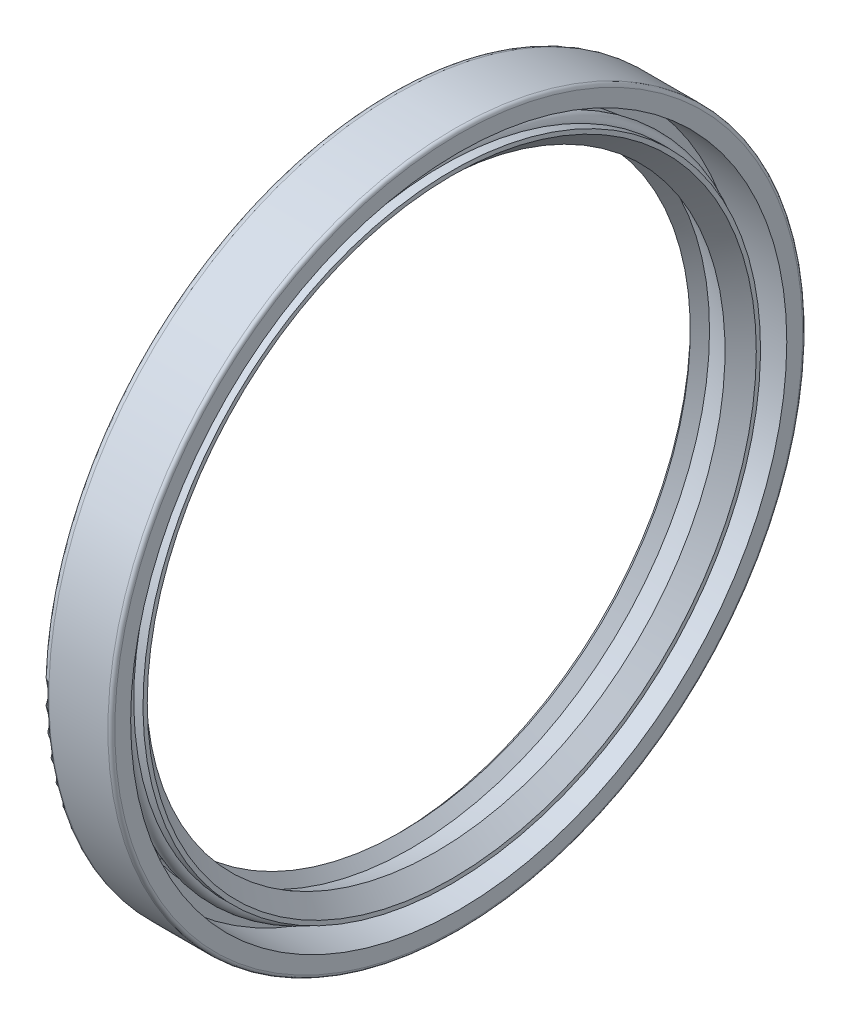
ISO-10303-21;
HEADER;
FILE_DESCRIPTION(('STEP AP214'),'2;1');
FILE_NAME('part.step','',(''),(''),'','','');
FILE_SCHEMA(('AUTOMOTIVE_DESIGN { 1 0 10303 214 1 1 1 1 }'));
ENDSEC;
DATA;
#1=APPLICATION_CONTEXT('core data for automotive mechanical design processes');
#2=APPLICATION_PROTOCOL_DEFINITION('international standard','automotive_design',2000,#1);
#3=PRODUCT_CONTEXT('',#1,'mechanical');
#4=PRODUCT('Part','Part','',(#3));
#5=PRODUCT_RELATED_PRODUCT_CATEGORY('part','',(#4));
#6=PRODUCT_DEFINITION_FORMATION('','',#4);
#7=PRODUCT_DEFINITION_CONTEXT('part definition',#1,'design');
#8=PRODUCT_DEFINITION('design','',#6,#7);
#9=PRODUCT_DEFINITION_SHAPE('','',#8);
#10=(LENGTH_UNIT() NAMED_UNIT(*) SI_UNIT(.MILLI.,.METRE.));
#11=(NAMED_UNIT(*) PLANE_ANGLE_UNIT() SI_UNIT($,.RADIAN.));
#12=(NAMED_UNIT(*) SI_UNIT($,.STERADIAN.) SOLID_ANGLE_UNIT());
#13=UNCERTAINTY_MEASURE_WITH_UNIT(LENGTH_MEASURE(1.E-05),#10,'distance_accuracy_value','');
#14=(GEOMETRIC_REPRESENTATION_CONTEXT(3) GLOBAL_UNCERTAINTY_ASSIGNED_CONTEXT((#13)) GLOBAL_UNIT_ASSIGNED_CONTEXT((#10,
#11,#12)) REPRESENTATION_CONTEXT('',''));
#15=CARTESIAN_POINT('',(0.,0.,0.));
#16=DIRECTION('',(0.,0.,1.));
#17=DIRECTION('',(1.,0.,0.));
#18=AXIS2_PLACEMENT_3D('',#15,#16,#17);
#19=CARTESIAN_POINT('',(8.,0.,0.));
#20=DIRECTION('',(-1.,0.,0.));
#21=DIRECTION('',(0.,0.,1.));
#22=AXIS2_PLACEMENT_3D('',#19,#20,#21);
#23=TOROIDAL_SURFACE('',#22,53.3333333333333,1.20000000000001);
#24=CARTESIAN_POINT('',(8.,0.,54.5333333333333));
#25=VERTEX_POINT('',#24);
#26=VERTEX_LOOP('',#25);
#27=FACE_BOUND('',#26,.T.);
#28=ADVANCED_FACE('F47',(#27),#23,.T.);
#29=CLOSED_SHELL('',(#28));
#30=MANIFOLD_SOLID_BREP('B2',#29);
#31=CARTESIAN_POINT('',(0.,58.8,0.));
#32=DIRECTION('',(1.,0.,0.));
#33=DIRECTION('',(0.,1.,0.));
#34=AXIS2_PLACEMENT_3D('',#31,#32,#33);
#35=PLANE('',#34);
#36=CARTESIAN_POINT('',(0.,0.,0.));
#37=DIRECTION('',(-1.,0.,0.));
#38=DIRECTION('',(0.,-1.,0.));
#39=AXIS2_PLACEMENT_3D('',#36,#37,#38);
#40=CIRCLE('',#39,56.6666666666667);
#41=CARTESIAN_POINT('',(0.,-56.6666666666667,0.));
#42=VERTEX_POINT('',#41);
#43=EDGE_CURVE('E46',#42,#42,#40,.T.);
#44=ORIENTED_EDGE('',*,*,#43,.F.);
#45=EDGE_LOOP('',(#44));
#46=FACE_BOUND('',#45,.T.);
#47=CARTESIAN_POINT('',(0.,0.,0.));
#48=DIRECTION('',(-1.,0.,0.));
#49=DIRECTION('',(0.,-1.,0.));
#50=AXIS2_PLACEMENT_3D('',#47,#48,#49);
#51=CIRCLE('',#50,58.8);
#52=CARTESIAN_POINT('',(0.,-58.8,0.));
#53=VERTEX_POINT('',#52);
#54=EDGE_CURVE('E153',#53,#53,#51,.T.);
#55=ORIENTED_EDGE('',*,*,#54,.T.);
#56=EDGE_LOOP('',(#55));
#57=FACE_BOUND('',#56,.T.);
#58=ADVANCED_FACE('F60',(#46,#57),#35,.F.);
#59=CARTESIAN_POINT('',(12.,0.,0.));
#60=DIRECTION('',(-1.,0.,0.));
#61=DIRECTION('',(0.,-1.,0.));
#62=AXIS2_PLACEMENT_3D('',#59,#60,#61);
#63=CYLINDRICAL_SURFACE('',#62,56.6666666666666);
#64=CARTESIAN_POINT('',(0.375,0.,0.));
#65=DIRECTION('',(-1.,0.,0.));
#66=DIRECTION('',(0.,-1.,0.));
#67=AXIS2_PLACEMENT_3D('',#64,#65,#66);
#68=CIRCLE('',#67,56.6666666666666);
#69=CARTESIAN_POINT('',(0.375,-56.6666666666666,0.));
#70=VERTEX_POINT('',#69);
#71=EDGE_CURVE('E67',#70,#70,#68,.T.);
#72=ORIENTED_EDGE('',*,*,#71,.F.);
#73=EDGE_LOOP('',(#72));
#74=FACE_BOUND('',#73,.T.);
#75=ORIENTED_EDGE('',*,*,#43,.T.);
#76=EDGE_LOOP('',(#75));
#77=FACE_BOUND('',#76,.T.);
#78=ADVANCED_FACE('F276',(#74,#77),#63,.F.);
#79=CARTESIAN_POINT('',(0.375,56.6666666666666,0.));
#80=DIRECTION('',(1.,0.,0.));
#81=DIRECTION('',(0.,1.,0.));
#82=AXIS2_PLACEMENT_3D('',#79,#80,#81);
#83=PLANE('',#82);
#84=CARTESIAN_POINT('',(0.375,0.,0.));
#85=DIRECTION('',(-1.,0.,0.));
#86=DIRECTION('',(0.,-1.,0.));
#87=AXIS2_PLACEMENT_3D('',#84,#85,#86);
#88=CIRCLE('',#87,53.3333333333333);
#89=CARTESIAN_POINT('',(0.375,-53.3333333333333,0.));
#90=VERTEX_POINT('',#89);
#91=EDGE_CURVE('E73',#90,#90,#88,.T.);
#92=ORIENTED_EDGE('',*,*,#91,.F.);
#93=EDGE_LOOP('',(#92));
#94=FACE_BOUND('',#93,.T.);
#95=ORIENTED_EDGE('',*,*,#71,.T.);
#96=EDGE_LOOP('',(#95));
#97=FACE_BOUND('',#96,.T.);
#98=ADVANCED_FACE('F271',(#94,#97),#83,.F.);
#99=CARTESIAN_POINT('',(12.,0.,0.));
#100=DIRECTION('',(-1.,0.,0.));
#101=DIRECTION('',(0.,-1.,0.));
#102=AXIS2_PLACEMENT_3D('',#99,#100,#101);
#103=CYLINDRICAL_SURFACE('',#102,53.3333333333333);
#104=CARTESIAN_POINT('',(0.,0.,0.));
#105=DIRECTION('',(-1.,0.,0.));
#106=DIRECTION('',(0.,-1.,0.));
#107=AXIS2_PLACEMENT_3D('',#104,#105,#106);
#108=CIRCLE('',#107,53.3333333333333);
#109=CARTESIAN_POINT('',(0.,-53.3333333333333,0.));
#110=VERTEX_POINT('',#109);
#111=EDGE_CURVE('E79',#110,#110,#108,.T.);
#112=ORIENTED_EDGE('',*,*,#111,.F.);
#113=EDGE_LOOP('',(#112));
#114=FACE_BOUND('',#113,.T.);
#115=ORIENTED_EDGE('',*,*,#91,.T.);
#116=EDGE_LOOP('',(#115));
#117=FACE_BOUND('',#116,.T.);
#118=ADVANCED_FACE('F265',(#114,#117),#103,.T.);
#119=CARTESIAN_POINT('',(0.,53.3333333333333,0.));
#120=DIRECTION('',(1.,0.,0.));
#121=DIRECTION('',(0.,1.,0.));
#122=AXIS2_PLACEMENT_3D('',#119,#120,#121);
#123=PLANE('',#122);
#124=CARTESIAN_POINT('',(0.,0.,0.));
#125=DIRECTION('',(-1.,0.,0.));
#126=DIRECTION('',(0.,-1.,0.));
#127=AXIS2_PLACEMENT_3D('',#124,#125,#126);
#128=CIRCLE('',#127,52.5);
#129=CARTESIAN_POINT('',(0.,-52.5,0.));
#130=VERTEX_POINT('',#129);
#131=EDGE_CURVE('E85',#130,#130,#128,.T.);
#132=ORIENTED_EDGE('',*,*,#131,.F.);
#133=EDGE_LOOP('',(#132));
#134=FACE_BOUND('',#133,.T.);
#135=ORIENTED_EDGE('',*,*,#111,.T.);
#136=EDGE_LOOP('',(#135));
#137=FACE_BOUND('',#136,.T.);
#138=ADVANCED_FACE('F259',(#134,#137),#123,.F.);
#139=CARTESIAN_POINT('',(0.,0.,0.));
#140=DIRECTION('',(-1.,0.,0.));
#141=DIRECTION('',(0.,-1.,0.));
#142=AXIS2_PLACEMENT_3D('',#139,#140,#141);
#143=CONICAL_SURFACE('',#142,52.5,0.394791119699764);
#144=CARTESIAN_POINT('',(2.,0.,0.));
#145=DIRECTION('',(-1.,0.,0.));
#146=DIRECTION('',(0.,-1.,0.));
#147=AXIS2_PLACEMENT_3D('',#144,#145,#146);
#148=CIRCLE('',#147,51.6666666666667);
#149=CARTESIAN_POINT('',(2.,-51.6666666666667,0.));
#150=VERTEX_POINT('',#149);
#151=EDGE_CURVE('E89',#150,#150,#148,.T.);
#152=ORIENTED_EDGE('',*,*,#151,.F.);
#153=EDGE_LOOP('',(#152));
#154=FACE_BOUND('',#153,.T.);
#155=ORIENTED_EDGE('',*,*,#131,.T.);
#156=EDGE_LOOP('',(#155));
#157=FACE_BOUND('',#156,.T.);
#158=ADVANCED_FACE('F253',(#154,#157),#143,.F.);
#159=CARTESIAN_POINT('',(2.,0.,0.));
#160=DIRECTION('',(1.,0.,0.));
#161=DIRECTION('',(0.,1.,0.));
#162=AXIS2_PLACEMENT_3D('',#159,#160,#161);
#163=CONICAL_SURFACE('',#162,51.6666666666667,0.78825714297284);
#164=CARTESIAN_POINT('',(1.1666802895699,0.,0.));
#165=DIRECTION('',(-1.,0.,0.));
#166=DIRECTION('',(0.,-1.,0.));
#167=AXIS2_PLACEMENT_3D('',#164,#165,#166);
#168=CIRCLE('',#167,50.8285683933394);
#169=CARTESIAN_POINT('',(1.1666802895699,-50.8285683933394,0.));
#170=VERTEX_POINT('',#169);
#171=EDGE_CURVE('E93',#170,#170,#168,.T.);
#172=ORIENTED_EDGE('',*,*,#171,.F.);
#173=EDGE_LOOP('',(#172));
#174=FACE_BOUND('',#173,.T.);
#175=ORIENTED_EDGE('',*,*,#151,.T.);
#176=EDGE_LOOP('',(#175));
#177=FACE_BOUND('',#176,.T.);
#178=ADVANCED_FACE('F247',(#174,#177),#163,.T.);
#179=CARTESIAN_POINT('',(1.1666802895699,0.,0.));
#180=DIRECTION('',(-1.,0.,0.));
#181=DIRECTION('',(0.,-1.,0.));
#182=AXIS2_PLACEMENT_3D('',#179,#180,#181);
#183=CONICAL_SURFACE('',#182,50.8285683933394,0.782539183822057);
#184=CARTESIAN_POINT('',(2.,0.,0.));
#185=DIRECTION('',(-1.,0.,0.));
#186=DIRECTION('',(0.,-1.,0.));
#187=AXIS2_PLACEMENT_3D('',#184,#185,#186);
#188=CIRCLE('',#187,50.);
#189=CARTESIAN_POINT('',(2.,-50.,0.));
#190=VERTEX_POINT('',#189);
#191=EDGE_CURVE('E97',#190,#190,#188,.T.);
#192=ORIENTED_EDGE('',*,*,#191,.F.);
#193=EDGE_LOOP('',(#192));
#194=FACE_BOUND('',#193,.T.);
#195=ORIENTED_EDGE('',*,*,#171,.T.);
#196=EDGE_LOOP('',(#195));
#197=FACE_BOUND('',#196,.T.);
#198=ADVANCED_FACE('F241',(#194,#197),#183,.F.);
#199=CARTESIAN_POINT('',(2.,0.,0.));
#200=DIRECTION('',(1.,0.,0.));
#201=DIRECTION('',(0.,1.,0.));
#202=AXIS2_PLACEMENT_3D('',#199,#200,#201);
#203=CONICAL_SURFACE('',#202,50.,0.788257142972842);
#204=CARTESIAN_POINT('',(3.65716387713869,0.,0.));
#205=DIRECTION('',(-1.,0.,0.));
#206=DIRECTION('',(0.,-1.,0.));
#207=AXIS2_PLACEMENT_3D('',#204,#205,#206);
#208=CIRCLE('',#207,51.6666666666667);
#209=CARTESIAN_POINT('',(3.65716387713869,-51.6666666666667,0.));
#210=VERTEX_POINT('',#209);
#211=EDGE_CURVE('E101',#210,#210,#208,.T.);
#212=ORIENTED_EDGE('',*,*,#211,.F.);
#213=EDGE_LOOP('',(#212));
#214=FACE_BOUND('',#213,.T.);
#215=ORIENTED_EDGE('',*,*,#191,.T.);
#216=EDGE_LOOP('',(#215));
#217=FACE_BOUND('',#216,.T.);
#218=ADVANCED_FACE('F235',(#214,#217),#203,.F.);
#219=CARTESIAN_POINT('',(3.65716387713869,0.,0.));
#220=DIRECTION('',(-1.,0.,0.));
#221=DIRECTION('',(0.,-1.,0.));
#222=AXIS2_PLACEMENT_3D('',#219,#220,#221);
#223=CONICAL_SURFACE('',#222,51.6666666666667,0.36644048314215);
#224=CARTESIAN_POINT('',(8.,0.,0.));
#225=DIRECTION('',(-1.,0.,0.));
#226=DIRECTION('',(0.,-1.,0.));
#227=AXIS2_PLACEMENT_3D('',#224,#225,#226);
#228=CIRCLE('',#227,50.);
#229=CARTESIAN_POINT('',(8.,-50.,0.));
#230=VERTEX_POINT('',#229);
#231=EDGE_CURVE('E105',#230,#230,#228,.T.);
#232=ORIENTED_EDGE('',*,*,#231,.F.);
#233=EDGE_LOOP('',(#232));
#234=FACE_BOUND('',#233,.T.);
#235=ORIENTED_EDGE('',*,*,#211,.T.);
#236=EDGE_LOOP('',(#235));
#237=FACE_BOUND('',#236,.T.);
#238=ADVANCED_FACE('F229',(#234,#237),#223,.F.);
#239=CARTESIAN_POINT('',(8.,0.,0.));
#240=DIRECTION('',(1.,0.,0.));
#241=DIRECTION('',(0.,1.,0.));
#242=AXIS2_PLACEMENT_3D('',#239,#240,#241);
#243=CONICAL_SURFACE('',#242,50.,0.748378047523382);
#244=CARTESIAN_POINT('',(10.8,0.,0.));
#245=DIRECTION('',(-1.,0.,0.));
#246=DIRECTION('',(0.,-1.,0.));
#247=AXIS2_PLACEMENT_3D('',#244,#245,#246);
#248=CIRCLE('',#247,52.5999999999993);
#249=CARTESIAN_POINT('',(10.8,-52.5999999999993,0.));
#250=VERTEX_POINT('',#249);
#251=EDGE_CURVE('E109',#250,#250,#248,.T.);
#252=ORIENTED_EDGE('',*,*,#251,.F.);
#253=EDGE_LOOP('',(#252));
#254=FACE_BOUND('',#253,.T.);
#255=ORIENTED_EDGE('',*,*,#231,.T.);
#256=EDGE_LOOP('',(#255));
#257=FACE_BOUND('',#256,.T.);
#258=ADVANCED_FACE('F223',(#254,#257),#243,.F.);
#259=CARTESIAN_POINT('',(10.8,52.5999999999993,0.));
#260=DIRECTION('',(-1.,0.,0.));
#261=DIRECTION('',(0.,-1.,0.));
#262=AXIS2_PLACEMENT_3D('',#259,#260,#261);
#263=PLANE('',#262);
#264=CARTESIAN_POINT('',(10.8,0.,0.));
#265=DIRECTION('',(-1.,0.,0.));
#266=DIRECTION('',(0.,-1.,0.));
#267=AXIS2_PLACEMENT_3D('',#264,#265,#266);
#268=CIRCLE('',#267,53.3333333333333);
#269=CARTESIAN_POINT('',(10.8,-53.3333333333333,0.));
#270=VERTEX_POINT('',#269);
#271=EDGE_CURVE('E113',#270,#270,#268,.T.);
#272=ORIENTED_EDGE('',*,*,#271,.F.);
#273=EDGE_LOOP('',(#272));
#274=FACE_BOUND('',#273,.T.);
#275=ORIENTED_EDGE('',*,*,#251,.T.);
#276=EDGE_LOOP('',(#275));
#277=FACE_BOUND('',#276,.T.);
#278=ADVANCED_FACE('F217',(#274,#277),#263,.F.);
#279=CARTESIAN_POINT('',(12.,0.,0.));
#280=DIRECTION('',(-1.,0.,0.));
#281=DIRECTION('',(0.,-1.,0.));
#282=AXIS2_PLACEMENT_3D('',#279,#280,#281);
#283=CYLINDRICAL_SURFACE('',#282,53.3333333333333);
#284=CARTESIAN_POINT('',(9.20000000000001,0.,0.));
#285=DIRECTION('',(-1.,0.,0.));
#286=DIRECTION('',(0.,-1.,0.));
#287=AXIS2_PLACEMENT_3D('',#284,#285,#286);
#288=CIRCLE('',#287,53.3333333333333);
#289=CARTESIAN_POINT('',(9.20000000000001,-53.3333333333333,0.));
#290=VERTEX_POINT('',#289);
#291=EDGE_CURVE('E117',#290,#290,#288,.T.);
#292=ORIENTED_EDGE('',*,*,#291,.F.);
#293=EDGE_LOOP('',(#292));
#294=FACE_BOUND('',#293,.T.);
#295=ORIENTED_EDGE('',*,*,#271,.T.);
#296=EDGE_LOOP('',(#295));
#297=FACE_BOUND('',#296,.T.);
#298=ADVANCED_FACE('F211',(#294,#297),#283,.T.);
#299=CARTESIAN_POINT('',(8.,0.,0.));
#300=DIRECTION('',(-1.,0.,0.));
#301=DIRECTION('',(0.,-1.,0.));
#302=AXIS2_PLACEMENT_3D('',#299,#300,#301);
#303=TOROIDAL_SURFACE('',#302,53.3333333333333,1.20000000000001);
#304=CARTESIAN_POINT('',(6.79999999999999,0.,0.));
#305=DIRECTION('',(-1.,0.,0.));
#306=DIRECTION('',(0.,-1.,0.));
#307=AXIS2_PLACEMENT_3D('',#304,#305,#306);
#308=CIRCLE('',#307,53.3333333333333);
#309=CARTESIAN_POINT('',(6.79999999999999,-53.3333333333333,0.));
#310=VERTEX_POINT('',#309);
#311=EDGE_CURVE('E121',#310,#310,#308,.T.);
#312=ORIENTED_EDGE('',*,*,#311,.F.);
#313=EDGE_LOOP('',(#312));
#314=FACE_BOUND('',#313,.T.);
#315=ORIENTED_EDGE('',*,*,#291,.T.);
#316=EDGE_LOOP('',(#315));
#317=FACE_BOUND('',#316,.T.);
#318=ADVANCED_FACE('F205',(#314,#317),#303,.F.);
#319=CARTESIAN_POINT('',(12.,0.,0.));
#320=DIRECTION('',(-1.,0.,0.));
#321=DIRECTION('',(0.,-1.,0.));
#322=AXIS2_PLACEMENT_3D('',#319,#320,#321);
#323=CYLINDRICAL_SURFACE('',#322,53.3333333333333);
#324=CARTESIAN_POINT('',(4.6,0.,0.));
#325=DIRECTION('',(-1.,0.,0.));
#326=DIRECTION('',(0.,-1.,0.));
#327=AXIS2_PLACEMENT_3D('',#324,#325,#326);
#328=CIRCLE('',#327,53.3333333333333);
#329=CARTESIAN_POINT('',(4.6,-53.3333333333333,0.));
#330=VERTEX_POINT('',#329);
#331=EDGE_CURVE('E125',#330,#330,#328,.T.);
#332=ORIENTED_EDGE('',*,*,#331,.F.);
#333=EDGE_LOOP('',(#332));
#334=FACE_BOUND('',#333,.T.);
#335=ORIENTED_EDGE('',*,*,#311,.T.);
#336=EDGE_LOOP('',(#335));
#337=FACE_BOUND('',#336,.T.);
#338=ADVANCED_FACE('F199',(#334,#337),#323,.T.);
#339=CARTESIAN_POINT('',(4.6,0.,0.));
#340=DIRECTION('',(-1.,0.,0.));
#341=DIRECTION('',(0.,-1.,0.));
#342=AXIS2_PLACEMENT_3D('',#339,#340,#341);
#343=TOROIDAL_SURFACE('',#342,53.9333333333333,0.599999999999998);
#344=CARTESIAN_POINT('',(4.00000000000001,0.,0.));
#345=DIRECTION('',(-1.,0.,0.));
#346=DIRECTION('',(0.,-1.,0.));
#347=AXIS2_PLACEMENT_3D('',#344,#345,#346);
#348=CIRCLE('',#347,53.9333333333333);
#349=CARTESIAN_POINT('',(4.00000000000001,-53.9333333333333,0.));
#350=VERTEX_POINT('',#349);
#351=EDGE_CURVE('E129',#350,#350,#348,.T.);
#352=ORIENTED_EDGE('',*,*,#351,.F.);
#353=EDGE_LOOP('',(#352));
#354=FACE_BOUND('',#353,.T.);
#355=ORIENTED_EDGE('',*,*,#331,.T.);
#356=EDGE_LOOP('',(#355));
#357=FACE_BOUND('',#356,.T.);
#358=ADVANCED_FACE('F193',(#354,#357),#343,.F.);
#359=CARTESIAN_POINT('',(4.,53.9333333333333,0.));
#360=DIRECTION('',(-1.,0.,0.));
#361=DIRECTION('',(0.,-1.,0.));
#362=AXIS2_PLACEMENT_3D('',#359,#360,#361);
#363=PLANE('',#362);
#364=CARTESIAN_POINT('',(4.,0.,0.));
#365=DIRECTION('',(-1.,0.,0.));
#366=DIRECTION('',(0.,-1.,0.));
#367=AXIS2_PLACEMENT_3D('',#364,#365,#366);
#368=CIRCLE('',#367,56.6666666666667);
#369=CARTESIAN_POINT('',(4.,-56.6666666666667,0.));
#370=VERTEX_POINT('',#369);
#371=EDGE_CURVE('E133',#370,#370,#368,.T.);
#372=ORIENTED_EDGE('',*,*,#371,.F.);
#373=EDGE_LOOP('',(#372));
#374=FACE_BOUND('',#373,.T.);
#375=ORIENTED_EDGE('',*,*,#351,.T.);
#376=EDGE_LOOP('',(#375));
#377=FACE_BOUND('',#376,.T.);
#378=ADVANCED_FACE('F187',(#374,#377),#363,.F.);
#379=CARTESIAN_POINT('',(12.,0.,0.));
#380=DIRECTION('',(-1.,0.,0.));
#381=DIRECTION('',(0.,-1.,0.));
#382=AXIS2_PLACEMENT_3D('',#379,#380,#381);
#383=CYLINDRICAL_SURFACE('',#382,56.6666666666666);
#384=CARTESIAN_POINT('',(12.,0.,0.));
#385=DIRECTION('',(-1.,0.,0.));
#386=DIRECTION('',(0.,-1.,0.));
#387=AXIS2_PLACEMENT_3D('',#384,#385,#386);
#388=CIRCLE('',#387,56.6666666666666);
#389=CARTESIAN_POINT('',(12.,-56.6666666666666,0.));
#390=VERTEX_POINT('',#389);
#391=EDGE_CURVE('E137',#390,#390,#388,.T.);
#392=ORIENTED_EDGE('',*,*,#391,.F.);
#393=EDGE_LOOP('',(#392));
#394=FACE_BOUND('',#393,.T.);
#395=ORIENTED_EDGE('',*,*,#371,.T.);
#396=EDGE_LOOP('',(#395));
#397=FACE_BOUND('',#396,.T.);
#398=ADVANCED_FACE('F181',(#394,#397),#383,.F.);
#399=CARTESIAN_POINT('',(12.,56.6666666666666,0.));
#400=DIRECTION('',(-1.,0.,0.));
#401=DIRECTION('',(0.,-1.,0.));
#402=AXIS2_PLACEMENT_3D('',#399,#400,#401);
#403=PLANE('',#402);
#404=CARTESIAN_POINT('',(12.,0.,0.));
#405=DIRECTION('',(-1.,0.,0.));
#406=DIRECTION('',(0.,-1.,0.));
#407=AXIS2_PLACEMENT_3D('',#404,#405,#406);
#408=CIRCLE('',#407,59.4);
#409=CARTESIAN_POINT('',(12.,-59.4,0.));
#410=VERTEX_POINT('',#409);
#411=EDGE_CURVE('E141',#410,#410,#408,.T.);
#412=ORIENTED_EDGE('',*,*,#411,.F.);
#413=EDGE_LOOP('',(#412));
#414=FACE_BOUND('',#413,.T.);
#415=ORIENTED_EDGE('',*,*,#391,.T.);
#416=EDGE_LOOP('',(#415));
#417=FACE_BOUND('',#416,.T.);
#418=ADVANCED_FACE('F175',(#414,#417),#403,.F.);
#419=CARTESIAN_POINT('',(11.4,0.,0.));
#420=DIRECTION('',(-1.,0.,0.));
#421=DIRECTION('',(0.,-1.,0.));
#422=AXIS2_PLACEMENT_3D('',#419,#420,#421);
#423=TOROIDAL_SURFACE('',#422,59.4,0.600000000000032);
#424=CARTESIAN_POINT('',(11.4,0.,0.));
#425=DIRECTION('',(-1.,0.,0.));
#426=DIRECTION('',(0.,-1.,0.));
#427=AXIS2_PLACEMENT_3D('',#424,#425,#426);
#428=CIRCLE('',#427,60.);
#429=CARTESIAN_POINT('',(11.4,-60.,0.));
#430=VERTEX_POINT('',#429);
#431=EDGE_CURVE('E145',#430,#430,#428,.T.);
#432=ORIENTED_EDGE('',*,*,#431,.F.);
#433=EDGE_LOOP('',(#432));
#434=FACE_BOUND('',#433,.T.);
#435=ORIENTED_EDGE('',*,*,#411,.T.);
#436=EDGE_LOOP('',(#435));
#437=FACE_BOUND('',#436,.T.);
#438=ADVANCED_FACE('F169',(#434,#437),#423,.T.);
#439=CARTESIAN_POINT('',(12.,0.,0.));
#440=DIRECTION('',(-1.,0.,0.));
#441=DIRECTION('',(0.,-1.,0.));
#442=AXIS2_PLACEMENT_3D('',#439,#440,#441);
#443=CYLINDRICAL_SURFACE('',#442,60.);
#444=CARTESIAN_POINT('',(1.2,0.,0.));
#445=DIRECTION('',(-1.,0.,0.));
#446=DIRECTION('',(0.,-1.,0.));
#447=AXIS2_PLACEMENT_3D('',#444,#445,#446);
#448=CIRCLE('',#447,60.);
#449=CARTESIAN_POINT('',(1.2,-60.,0.));
#450=VERTEX_POINT('',#449);
#451=EDGE_CURVE('E149',#450,#450,#448,.T.);
#452=ORIENTED_EDGE('',*,*,#451,.F.);
#453=EDGE_LOOP('',(#452));
#454=FACE_BOUND('',#453,.T.);
#455=ORIENTED_EDGE('',*,*,#431,.T.);
#456=EDGE_LOOP('',(#455));
#457=FACE_BOUND('',#456,.T.);
#458=ADVANCED_FACE('F163',(#454,#457),#443,.T.);
#459=CARTESIAN_POINT('',(1.2,0.,0.));
#460=DIRECTION('',(-1.,0.,0.));
#461=DIRECTION('',(0.,-1.,0.));
#462=AXIS2_PLACEMENT_3D('',#459,#460,#461);
#463=TOROIDAL_SURFACE('',#462,58.8,1.20000000000001);
#464=ORIENTED_EDGE('',*,*,#54,.F.);
#465=EDGE_LOOP('',(#464));
#466=FACE_BOUND('',#465,.T.);
#467=ORIENTED_EDGE('',*,*,#451,.T.);
#468=EDGE_LOOP('',(#467));
#469=FACE_BOUND('',#468,.T.);
#470=ADVANCED_FACE('F160',(#466,#469),#463,.T.);
#471=CLOSED_SHELL('',(#58,#78,#98,#118,#138,#158,#178,#198,#218,#238,#258,#278,#298,#318,#338,
#358,#378,#398,#418,#438,#458,#470));
#472=MANIFOLD_SOLID_BREP('B6',#471);
#473=ADVANCED_BREP_SHAPE_REPRESENTATION('',(#18,#30,#472),#14);
#474=SHAPE_DEFINITION_REPRESENTATION(#9,#473);
ENDSEC;
END-ISO-10303-21;
